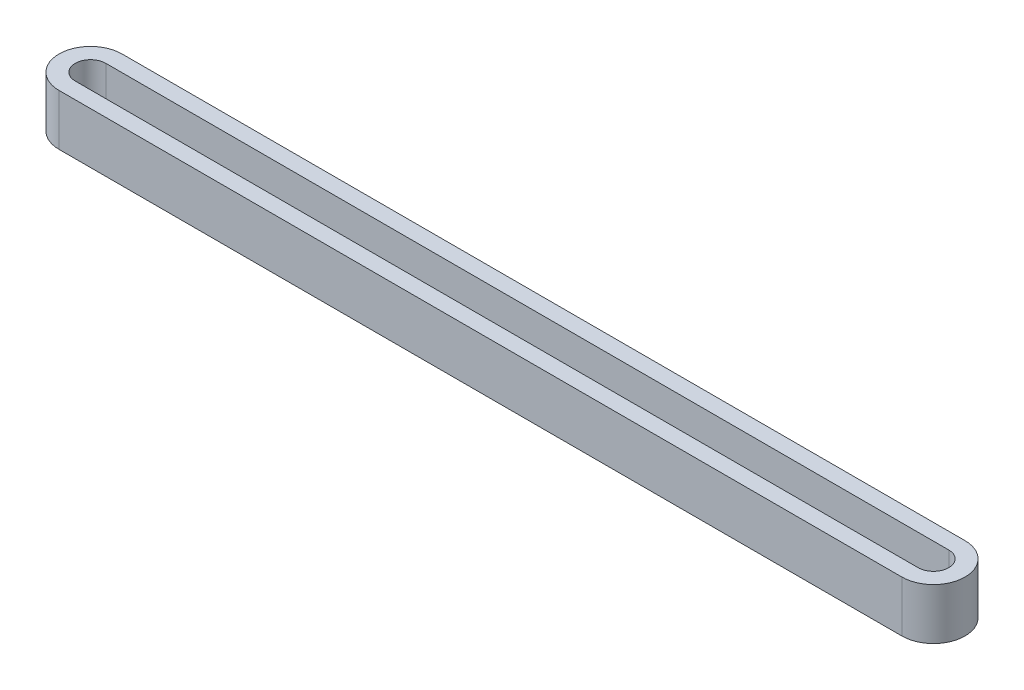
ISO-10303-21;
HEADER;
FILE_DESCRIPTION(('STEP AP214'),'2;1');
FILE_NAME('part.step','',(''),(''),'','','');
FILE_SCHEMA(('AUTOMOTIVE_DESIGN { 1 0 10303 214 1 1 1 1 }'));
ENDSEC;
DATA;
#1=APPLICATION_CONTEXT('core data for automotive mechanical design processes');
#2=APPLICATION_PROTOCOL_DEFINITION('international standard','automotive_design',2000,#1);
#3=PRODUCT_CONTEXT('',#1,'mechanical');
#4=PRODUCT('Part','Part','',(#3));
#5=PRODUCT_RELATED_PRODUCT_CATEGORY('part','',(#4));
#6=PRODUCT_DEFINITION_FORMATION('','',#4);
#7=PRODUCT_DEFINITION_CONTEXT('part definition',#1,'design');
#8=PRODUCT_DEFINITION('design','',#6,#7);
#9=PRODUCT_DEFINITION_SHAPE('','',#8);
#10=(LENGTH_UNIT() NAMED_UNIT(*) SI_UNIT(.MILLI.,.METRE.));
#11=(NAMED_UNIT(*) PLANE_ANGLE_UNIT() SI_UNIT($,.RADIAN.));
#12=(NAMED_UNIT(*) SI_UNIT($,.STERADIAN.) SOLID_ANGLE_UNIT());
#13=UNCERTAINTY_MEASURE_WITH_UNIT(LENGTH_MEASURE(1.E-05),#10,'distance_accuracy_value','');
#14=(GEOMETRIC_REPRESENTATION_CONTEXT(3) GLOBAL_UNCERTAINTY_ASSIGNED_CONTEXT((#13)) GLOBAL_UNIT_ASSIGNED_CONTEXT((#10,
#11,#12)) REPRESENTATION_CONTEXT('',''));
#15=CARTESIAN_POINT('',(0.,0.,0.));
#16=DIRECTION('',(0.,0.,1.));
#17=DIRECTION('',(1.,0.,0.));
#18=AXIS2_PLACEMENT_3D('',#15,#16,#17);
#19=CARTESIAN_POINT('',(-82.5,10.,0.));
#20=DIRECTION('',(0.,1.,0.));
#21=DIRECTION('',(0.,0.,1.));
#22=AXIS2_PLACEMENT_3D('',#19,#20,#21);
#23=PLANE('',#22);
#24=CARTESIAN_POINT('',(-82.5,10.,0.));
#25=DIRECTION('',(0.,1.,0.));
#26=DIRECTION('',(0.,0.,1.));
#27=AXIS2_PLACEMENT_3D('',#24,#25,#26);
#28=CIRCLE('',#27,6.175);
#29=CARTESIAN_POINT('',(-82.5,10.,-6.17499999999999));
#30=VERTEX_POINT('',#29);
#31=CARTESIAN_POINT('',(-82.5,10.,6.17500000000001));
#32=VERTEX_POINT('',#31);
#33=EDGE_CURVE('E161',#30,#32,#28,.T.);
#34=ORIENTED_EDGE('',*,*,#33,.T.);
#35=DIRECTION('',(1.,0.,0.));
#36=VECTOR('',#35,1.);
#37=CARTESIAN_POINT('',(82.5,10.,6.17499999999999));
#38=LINE('',#37,#36);
#39=CARTESIAN_POINT('',(82.5,10.,6.17499999999999));
#40=VERTEX_POINT('',#39);
#41=EDGE_CURVE('E165',#32,#40,#38,.T.);
#42=ORIENTED_EDGE('',*,*,#41,.T.);
#43=CARTESIAN_POINT('',(82.5,10.,0.));
#44=DIRECTION('',(0.,1.,0.));
#45=DIRECTION('',(0.,0.,-1.));
#46=AXIS2_PLACEMENT_3D('',#43,#44,#45);
#47=CIRCLE('',#46,6.175);
#48=CARTESIAN_POINT('',(82.5,10.,-6.17500000000001));
#49=VERTEX_POINT('',#48);
#50=EDGE_CURVE('E169',#40,#49,#47,.T.);
#51=ORIENTED_EDGE('',*,*,#50,.T.);
#52=DIRECTION('',(-1.,0.,0.));
#53=VECTOR('',#52,1.);
#54=CARTESIAN_POINT('',(82.5,10.,-6.17500000000001));
#55=LINE('',#54,#53);
#56=EDGE_CURVE('E172',#49,#30,#55,.T.);
#57=ORIENTED_EDGE('',*,*,#56,.T.);
#58=EDGE_LOOP('',(#34,#42,#51,#57));
#59=FACE_BOUND('',#58,.T.);
#60=DIRECTION('',(1.,0.,0.));
#61=VECTOR('',#60,1.);
#62=CARTESIAN_POINT('',(82.5,10.,2.99999999999999));
#63=LINE('',#62,#61);
#64=CARTESIAN_POINT('',(-82.5,10.,3.00000000000001));
#65=VERTEX_POINT('',#64);
#66=CARTESIAN_POINT('',(82.5,10.,2.99999999999999));
#67=VERTEX_POINT('',#66);
#68=EDGE_CURVE('E122',#65,#67,#63,.T.);
#69=ORIENTED_EDGE('',*,*,#68,.F.);
#70=CARTESIAN_POINT('',(-82.5,10.,0.));
#71=DIRECTION('',(0.,1.,0.));
#72=DIRECTION('',(0.,0.,1.));
#73=AXIS2_PLACEMENT_3D('',#70,#71,#72);
#74=CIRCLE('',#73,3.);
#75=CARTESIAN_POINT('',(-82.5,10.,-2.99999999999999));
#76=VERTEX_POINT('',#75);
#77=EDGE_CURVE('E113',#76,#65,#74,.T.);
#78=ORIENTED_EDGE('',*,*,#77,.F.);
#79=DIRECTION('',(-1.,0.,0.));
#80=VECTOR('',#79,1.);
#81=CARTESIAN_POINT('',(82.5,10.,-3.00000000000001));
#82=LINE('',#81,#80);
#83=CARTESIAN_POINT('',(82.5,10.,-3.00000000000001));
#84=VERTEX_POINT('',#83);
#85=EDGE_CURVE('E139',#84,#76,#82,.T.);
#86=ORIENTED_EDGE('',*,*,#85,.F.);
#87=CARTESIAN_POINT('',(82.5,10.,0.));
#88=DIRECTION('',(0.,1.,0.));
#89=DIRECTION('',(0.,0.,-1.));
#90=AXIS2_PLACEMENT_3D('',#87,#88,#89);
#91=CIRCLE('',#90,3.);
#92=EDGE_CURVE('E135',#67,#84,#91,.T.);
#93=ORIENTED_EDGE('',*,*,#92,.F.);
#94=EDGE_LOOP('',(#69,#78,#86,#93));
#95=FACE_BOUND('',#94,.T.);
#96=ADVANCED_FACE('F47',(#59,#95),#23,.T.);
#97=CARTESIAN_POINT('',(-82.5,0.,0.));
#98=DIRECTION('',(0.,1.,0.));
#99=DIRECTION('',(0.,0.,1.));
#100=AXIS2_PLACEMENT_3D('',#97,#98,#99);
#101=PLANE('',#100);
#102=CARTESIAN_POINT('',(-82.5,0.,0.));
#103=DIRECTION('',(0.,1.,0.));
#104=DIRECTION('',(0.,0.,1.));
#105=AXIS2_PLACEMENT_3D('',#102,#103,#104);
#106=CIRCLE('',#105,6.175);
#107=CARTESIAN_POINT('',(-82.5,0.,-6.17499999999999));
#108=VERTEX_POINT('',#107);
#109=CARTESIAN_POINT('',(-82.5,0.,6.17500000000001));
#110=VERTEX_POINT('',#109);
#111=EDGE_CURVE('E131',#108,#110,#106,.T.);
#112=ORIENTED_EDGE('',*,*,#111,.F.);
#113=DIRECTION('',(-1.,0.,0.));
#114=VECTOR('',#113,1.);
#115=CARTESIAN_POINT('',(82.5,0.,-6.17500000000001));
#116=LINE('',#115,#114);
#117=CARTESIAN_POINT('',(82.5,0.,-6.17500000000001));
#118=VERTEX_POINT('',#117);
#119=EDGE_CURVE('E166',#118,#108,#116,.T.);
#120=ORIENTED_EDGE('',*,*,#119,.F.);
#121=CARTESIAN_POINT('',(82.5,0.,0.));
#122=DIRECTION('',(0.,1.,0.));
#123=DIRECTION('',(0.,0.,-1.));
#124=AXIS2_PLACEMENT_3D('',#121,#122,#123);
#125=CIRCLE('',#124,6.175);
#126=CARTESIAN_POINT('',(82.5,0.,6.17499999999999));
#127=VERTEX_POINT('',#126);
#128=EDGE_CURVE('E182',#127,#118,#125,.T.);
#129=ORIENTED_EDGE('',*,*,#128,.F.);
#130=DIRECTION('',(1.,0.,0.));
#131=VECTOR('',#130,1.);
#132=CARTESIAN_POINT('',(82.5,0.,6.17499999999999));
#133=LINE('',#132,#131);
#134=EDGE_CURVE('E179',#110,#127,#133,.T.);
#135=ORIENTED_EDGE('',*,*,#134,.F.);
#136=EDGE_LOOP('',(#112,#120,#129,#135));
#137=FACE_BOUND('',#136,.T.);
#138=CARTESIAN_POINT('',(-82.5,0.,0.));
#139=DIRECTION('',(0.,1.,0.));
#140=DIRECTION('',(0.,0.,1.));
#141=AXIS2_PLACEMENT_3D('',#138,#139,#140);
#142=CIRCLE('',#141,3.);
#143=CARTESIAN_POINT('',(-82.5,0.,-2.99999999999999));
#144=VERTEX_POINT('',#143);
#145=CARTESIAN_POINT('',(-82.5,0.,3.00000000000001));
#146=VERTEX_POINT('',#145);
#147=EDGE_CURVE('E71',#144,#146,#142,.T.);
#148=ORIENTED_EDGE('',*,*,#147,.T.);
#149=DIRECTION('',(1.,0.,0.));
#150=VECTOR('',#149,1.);
#151=CARTESIAN_POINT('',(82.5,0.,2.99999999999999));
#152=LINE('',#151,#150);
#153=CARTESIAN_POINT('',(82.5,0.,2.99999999999999));
#154=VERTEX_POINT('',#153);
#155=EDGE_CURVE('E129',#146,#154,#152,.T.);
#156=ORIENTED_EDGE('',*,*,#155,.T.);
#157=CARTESIAN_POINT('',(82.5,0.,0.));
#158=DIRECTION('',(0.,1.,0.));
#159=DIRECTION('',(0.,0.,-1.));
#160=AXIS2_PLACEMENT_3D('',#157,#158,#159);
#161=CIRCLE('',#160,3.);
#162=CARTESIAN_POINT('',(82.5,0.,-3.00000000000001));
#163=VERTEX_POINT('',#162);
#164=EDGE_CURVE('E148',#154,#163,#161,.T.);
#165=ORIENTED_EDGE('',*,*,#164,.T.);
#166=DIRECTION('',(-1.,0.,0.));
#167=VECTOR('',#166,1.);
#168=CARTESIAN_POINT('',(82.5,0.,-3.00000000000001));
#169=LINE('',#168,#167);
#170=EDGE_CURVE('E123',#163,#144,#169,.T.);
#171=ORIENTED_EDGE('',*,*,#170,.T.);
#172=EDGE_LOOP('',(#148,#156,#165,#171));
#173=FACE_BOUND('',#172,.T.);
#174=ADVANCED_FACE('F205',(#137,#173),#101,.F.);
#175=CARTESIAN_POINT('',(-82.5,10.,0.));
#176=DIRECTION('',(0.,-1.,0.));
#177=DIRECTION('',(0.,0.,-1.));
#178=AXIS2_PLACEMENT_3D('',#175,#176,#177);
#179=CYLINDRICAL_SURFACE('',#178,6.175);
#180=ORIENTED_EDGE('',*,*,#111,.T.);
#181=DIRECTION('',(0.,-1.,0.));
#182=VECTOR('',#181,1.);
#183=CARTESIAN_POINT('',(-82.5,10.,6.17500000000001));
#184=LINE('',#183,#182);
#185=EDGE_CURVE('E11',#32,#110,#184,.T.);
#186=ORIENTED_EDGE('',*,*,#185,.F.);
#187=ORIENTED_EDGE('',*,*,#33,.F.);
#188=DIRECTION('',(0.,-1.,0.));
#189=VECTOR('',#188,1.);
#190=CARTESIAN_POINT('',(-82.5,10.,-6.17499999999999));
#191=LINE('',#190,#189);
#192=EDGE_CURVE('E175',#30,#108,#191,.T.);
#193=ORIENTED_EDGE('',*,*,#192,.T.);
#194=EDGE_LOOP('',(#180,#186,#187,#193));
#195=FACE_BOUND('',#194,.T.);
#196=ADVANCED_FACE('F49',(#195),#179,.T.);
#197=CARTESIAN_POINT('',(82.5,10.,6.17499999999999));
#198=DIRECTION('',(0.,0.,-1.));
#199=DIRECTION('',(-1.,0.,0.));
#200=AXIS2_PLACEMENT_3D('',#197,#198,#199);
#201=PLANE('',#200);
#202=ORIENTED_EDGE('',*,*,#134,.T.);
#203=DIRECTION('',(0.,-1.,0.));
#204=VECTOR('',#203,1.);
#205=CARTESIAN_POINT('',(82.5,10.,6.17499999999999));
#206=LINE('',#205,#204);
#207=EDGE_CURVE('E56',#40,#127,#206,.T.);
#208=ORIENTED_EDGE('',*,*,#207,.F.);
#209=ORIENTED_EDGE('',*,*,#41,.F.);
#210=ORIENTED_EDGE('',*,*,#185,.T.);
#211=EDGE_LOOP('',(#202,#208,#209,#210));
#212=FACE_BOUND('',#211,.T.);
#213=ADVANCED_FACE('F215',(#212),#201,.F.);
#214=CARTESIAN_POINT('',(82.5,10.,0.));
#215=DIRECTION('',(0.,-1.,0.));
#216=DIRECTION('',(0.,0.,-1.));
#217=AXIS2_PLACEMENT_3D('',#214,#215,#216);
#218=CYLINDRICAL_SURFACE('',#217,6.175);
#219=ORIENTED_EDGE('',*,*,#128,.T.);
#220=DIRECTION('',(0.,-1.,0.));
#221=VECTOR('',#220,1.);
#222=CARTESIAN_POINT('',(82.5,10.,-6.17500000000001));
#223=LINE('',#222,#221);
#224=EDGE_CURVE('E190',#49,#118,#223,.T.);
#225=ORIENTED_EDGE('',*,*,#224,.F.);
#226=ORIENTED_EDGE('',*,*,#50,.F.);
#227=ORIENTED_EDGE('',*,*,#207,.T.);
#228=EDGE_LOOP('',(#219,#225,#226,#227));
#229=FACE_BOUND('',#228,.T.);
#230=ADVANCED_FACE('F199',(#229),#218,.T.);
#231=CARTESIAN_POINT('',(82.5,10.,-6.17500000000001));
#232=DIRECTION('',(0.,0.,1.));
#233=DIRECTION('',(1.,0.,0.));
#234=AXIS2_PLACEMENT_3D('',#231,#232,#233);
#235=PLANE('',#234);
#236=ORIENTED_EDGE('',*,*,#119,.T.);
#237=ORIENTED_EDGE('',*,*,#192,.F.);
#238=ORIENTED_EDGE('',*,*,#56,.F.);
#239=ORIENTED_EDGE('',*,*,#224,.T.);
#240=EDGE_LOOP('',(#236,#237,#238,#239));
#241=FACE_BOUND('',#240,.T.);
#242=ADVANCED_FACE('F209',(#241),#235,.F.);
#243=CARTESIAN_POINT('',(-82.5,10.,0.));
#244=DIRECTION('',(0.,-1.,0.));
#245=DIRECTION('',(0.,0.,-1.));
#246=AXIS2_PLACEMENT_3D('',#243,#244,#245);
#247=CYLINDRICAL_SURFACE('',#246,3.);
#248=ORIENTED_EDGE('',*,*,#147,.F.);
#249=DIRECTION('',(0.,-1.,0.));
#250=VECTOR('',#249,1.);
#251=CARTESIAN_POINT('',(-82.5,10.,-2.99999999999999));
#252=LINE('',#251,#250);
#253=EDGE_CURVE('E117',#76,#144,#252,.T.);
#254=ORIENTED_EDGE('',*,*,#253,.F.);
#255=ORIENTED_EDGE('',*,*,#77,.T.);
#256=DIRECTION('',(0.,-1.,0.));
#257=VECTOR('',#256,1.);
#258=CARTESIAN_POINT('',(-82.5,10.,3.00000000000001));
#259=LINE('',#258,#257);
#260=EDGE_CURVE('E116',#65,#146,#259,.T.);
#261=ORIENTED_EDGE('',*,*,#260,.T.);
#262=EDGE_LOOP('',(#248,#254,#255,#261));
#263=FACE_BOUND('',#262,.T.);
#264=ADVANCED_FACE('F115',(#263),#247,.F.);
#265=CARTESIAN_POINT('',(82.5,10.,2.99999999999999));
#266=DIRECTION('',(0.,0.,-1.));
#267=DIRECTION('',(-1.,0.,0.));
#268=AXIS2_PLACEMENT_3D('',#265,#266,#267);
#269=PLANE('',#268);
#270=ORIENTED_EDGE('',*,*,#155,.F.);
#271=ORIENTED_EDGE('',*,*,#260,.F.);
#272=ORIENTED_EDGE('',*,*,#68,.T.);
#273=DIRECTION('',(0.,-1.,0.));
#274=VECTOR('',#273,1.);
#275=CARTESIAN_POINT('',(82.5,10.,2.99999999999999));
#276=LINE('',#275,#274);
#277=EDGE_CURVE('E132',#67,#154,#276,.T.);
#278=ORIENTED_EDGE('',*,*,#277,.T.);
#279=EDGE_LOOP('',(#270,#271,#272,#278));
#280=FACE_BOUND('',#279,.T.);
#281=ADVANCED_FACE('F126',(#280),#269,.T.);
#282=CARTESIAN_POINT('',(82.5,10.,0.));
#283=DIRECTION('',(0.,-1.,0.));
#284=DIRECTION('',(0.,0.,-1.));
#285=AXIS2_PLACEMENT_3D('',#282,#283,#284);
#286=CYLINDRICAL_SURFACE('',#285,3.);
#287=ORIENTED_EDGE('',*,*,#164,.F.);
#288=ORIENTED_EDGE('',*,*,#277,.F.);
#289=ORIENTED_EDGE('',*,*,#92,.T.);
#290=DIRECTION('',(0.,-1.,0.));
#291=VECTOR('',#290,1.);
#292=CARTESIAN_POINT('',(82.5,10.,-3.00000000000001));
#293=LINE('',#292,#291);
#294=EDGE_CURVE('E63',#84,#163,#293,.T.);
#295=ORIENTED_EDGE('',*,*,#294,.T.);
#296=EDGE_LOOP('',(#287,#288,#289,#295));
#297=FACE_BOUND('',#296,.T.);
#298=ADVANCED_FACE('F238',(#297),#286,.F.);
#299=CARTESIAN_POINT('',(82.5,10.,-3.00000000000001));
#300=DIRECTION('',(0.,0.,1.));
#301=DIRECTION('',(1.,0.,0.));
#302=AXIS2_PLACEMENT_3D('',#299,#300,#301);
#303=PLANE('',#302);
#304=ORIENTED_EDGE('',*,*,#170,.F.);
#305=ORIENTED_EDGE('',*,*,#294,.F.);
#306=ORIENTED_EDGE('',*,*,#85,.T.);
#307=ORIENTED_EDGE('',*,*,#253,.T.);
#308=EDGE_LOOP('',(#304,#305,#306,#307));
#309=FACE_BOUND('',#308,.T.);
#310=ADVANCED_FACE('F242',(#309),#303,.T.);
#311=CLOSED_SHELL('',(#96,#174,#196,#213,#230,#242,#264,#281,#298,#310));
#312=MANIFOLD_SOLID_BREP('B2',#311);
#313=ADVANCED_BREP_SHAPE_REPRESENTATION('',(#18,#312),#14);
#314=SHAPE_DEFINITION_REPRESENTATION(#9,#313);
ENDSEC;
END-ISO-10303-21;
